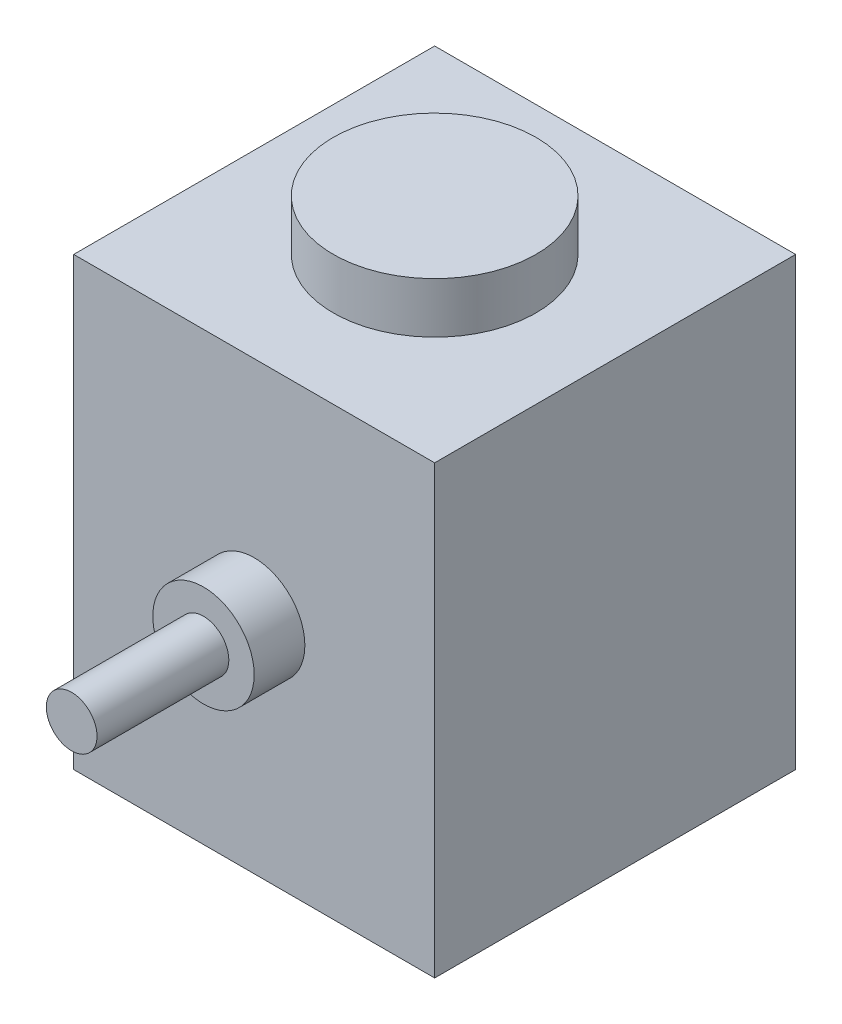
ISO-10303-21;
HEADER;
FILE_DESCRIPTION(('STEP AP214'),'2;1');
FILE_NAME('part.step','',(''),(''),'','','');
FILE_SCHEMA(('AUTOMOTIVE_DESIGN { 1 0 10303 214 1 1 1 1 }'));
ENDSEC;
DATA;
#1=APPLICATION_CONTEXT('core data for automotive mechanical design processes');
#2=APPLICATION_PROTOCOL_DEFINITION('international standard','automotive_design',2000,#1);
#3=PRODUCT_CONTEXT('',#1,'mechanical');
#4=PRODUCT('Part','Part','',(#3));
#5=PRODUCT_RELATED_PRODUCT_CATEGORY('part','',(#4));
#6=PRODUCT_DEFINITION_FORMATION('','',#4);
#7=PRODUCT_DEFINITION_CONTEXT('part definition',#1,'design');
#8=PRODUCT_DEFINITION('design','',#6,#7);
#9=PRODUCT_DEFINITION_SHAPE('','',#8);
#10=(LENGTH_UNIT() NAMED_UNIT(*) SI_UNIT(.MILLI.,.METRE.));
#11=(NAMED_UNIT(*) PLANE_ANGLE_UNIT() SI_UNIT($,.RADIAN.));
#12=(NAMED_UNIT(*) SI_UNIT($,.STERADIAN.) SOLID_ANGLE_UNIT());
#13=UNCERTAINTY_MEASURE_WITH_UNIT(LENGTH_MEASURE(1.E-05),#10,'distance_accuracy_value','');
#14=(GEOMETRIC_REPRESENTATION_CONTEXT(3) GLOBAL_UNCERTAINTY_ASSIGNED_CONTEXT((#13)) GLOBAL_UNIT_ASSIGNED_CONTEXT((#10,
#11,#12)) REPRESENTATION_CONTEXT('',''));
#15=CARTESIAN_POINT('',(0.,0.,0.));
#16=DIRECTION('',(0.,0.,1.));
#17=DIRECTION('',(1.,0.,0.));
#18=AXIS2_PLACEMENT_3D('',#15,#16,#17);
#19=CARTESIAN_POINT('',(-22.606,0.,0.));
#20=DIRECTION('',(1.,0.,0.));
#21=DIRECTION('',(0.,0.,-1.));
#22=AXIS2_PLACEMENT_3D('',#19,#20,#21);
#23=PLANE('',#22);
#24=DIRECTION('',(0.,-1.,0.));
#25=VECTOR('',#24,1.);
#26=CARTESIAN_POINT('',(-22.606,0.,45.212));
#27=LINE('',#26,#25);
#28=CARTESIAN_POINT('',(-22.606,62.23,45.212));
#29=VERTEX_POINT('',#28);
#30=CARTESIAN_POINT('',(-22.606,6.34999999999999,45.212));
#31=VERTEX_POINT('',#30);
#32=EDGE_CURVE('E111',#29,#31,#27,.T.);
#33=ORIENTED_EDGE('',*,*,#32,.F.);
#34=DIRECTION('',(0.,0.,-1.));
#35=VECTOR('',#34,1.);
#36=CARTESIAN_POINT('',(-22.606,62.23,0.));
#37=LINE('',#36,#35);
#38=CARTESIAN_POINT('',(-22.606,62.23,0.));
#39=VERTEX_POINT('',#38);
#40=EDGE_CURVE('E58',#29,#39,#37,.T.);
#41=ORIENTED_EDGE('',*,*,#40,.T.);
#42=DIRECTION('',(0.,1.,0.));
#43=VECTOR('',#42,1.);
#44=CARTESIAN_POINT('',(-22.606,0.,0.));
#45=LINE('',#44,#43);
#46=CARTESIAN_POINT('',(-22.606,6.35,0.));
#47=VERTEX_POINT('',#46);
#48=EDGE_CURVE('E102',#47,#39,#45,.T.);
#49=ORIENTED_EDGE('',*,*,#48,.F.);
#50=DIRECTION('',(0.,0.,1.));
#51=VECTOR('',#50,1.);
#52=CARTESIAN_POINT('',(-22.606,6.35,0.));
#53=LINE('',#52,#51);
#54=EDGE_CURVE('E66',#47,#31,#53,.T.);
#55=ORIENTED_EDGE('',*,*,#54,.T.);
#56=EDGE_LOOP('',(#33,#41,#49,#55));
#57=FACE_BOUND('',#56,.T.);
#58=ADVANCED_FACE('F41',(#57),#23,.F.);
#59=CARTESIAN_POINT('',(22.606,0.,0.));
#60=DIRECTION('',(1.,0.,0.));
#61=DIRECTION('',(0.,0.,-1.));
#62=AXIS2_PLACEMENT_3D('',#59,#60,#61);
#63=PLANE('',#62);
#64=DIRECTION('',(0.,0.,-1.));
#65=VECTOR('',#64,1.);
#66=CARTESIAN_POINT('',(22.606,62.23,0.));
#67=LINE('',#66,#65);
#68=CARTESIAN_POINT('',(22.606,62.23,45.212));
#69=VERTEX_POINT('',#68);
#70=CARTESIAN_POINT('',(22.606,62.23,0.));
#71=VERTEX_POINT('',#70);
#72=EDGE_CURVE('E86',#69,#71,#67,.T.);
#73=ORIENTED_EDGE('',*,*,#72,.F.);
#74=DIRECTION('',(0.,-1.,0.));
#75=VECTOR('',#74,1.);
#76=CARTESIAN_POINT('',(22.606,0.,45.212));
#77=LINE('',#76,#75);
#78=CARTESIAN_POINT('',(22.606,6.34999999999999,45.212));
#79=VERTEX_POINT('',#78);
#80=EDGE_CURVE('E90',#69,#79,#77,.T.);
#81=ORIENTED_EDGE('',*,*,#80,.T.);
#82=DIRECTION('',(0.,0.,1.));
#83=VECTOR('',#82,1.);
#84=CARTESIAN_POINT('',(22.606,6.35,0.));
#85=LINE('',#84,#83);
#86=CARTESIAN_POINT('',(22.606,6.35,0.));
#87=VERTEX_POINT('',#86);
#88=EDGE_CURVE('E104',#87,#79,#85,.T.);
#89=ORIENTED_EDGE('',*,*,#88,.F.);
#90=DIRECTION('',(0.,1.,0.));
#91=VECTOR('',#90,1.);
#92=CARTESIAN_POINT('',(22.606,0.,0.));
#93=LINE('',#92,#91);
#94=EDGE_CURVE('E93',#87,#71,#93,.T.);
#95=ORIENTED_EDGE('',*,*,#94,.T.);
#96=EDGE_LOOP('',(#73,#81,#89,#95));
#97=FACE_BOUND('',#96,.T.);
#98=ADVANCED_FACE('F88',(#97),#63,.T.);
#99=CARTESIAN_POINT('',(-22.606,0.,0.));
#100=DIRECTION('',(0.,0.,-1.));
#101=DIRECTION('',(-1.,0.,0.));
#102=AXIS2_PLACEMENT_3D('',#99,#100,#101);
#103=PLANE('',#102);
#104=DIRECTION('',(1.,0.,0.));
#105=VECTOR('',#104,1.);
#106=CARTESIAN_POINT('',(-22.606,62.23,0.));
#107=LINE('',#106,#105);
#108=EDGE_CURVE('E11',#39,#71,#107,.T.);
#109=ORIENTED_EDGE('',*,*,#108,.T.);
#110=ORIENTED_EDGE('',*,*,#94,.F.);
#111=DIRECTION('',(1.,0.,0.));
#112=VECTOR('',#111,1.);
#113=CARTESIAN_POINT('',(-22.606,6.35,0.));
#114=LINE('',#113,#112);
#115=EDGE_CURVE('E50',#47,#87,#114,.T.);
#116=ORIENTED_EDGE('',*,*,#115,.F.);
#117=ORIENTED_EDGE('',*,*,#48,.T.);
#118=EDGE_LOOP('',(#109,#110,#116,#117));
#119=FACE_BOUND('',#118,.T.);
#120=ADVANCED_FACE('F118',(#119),#103,.T.);
#121=CARTESIAN_POINT('',(-22.606,6.35,0.));
#122=DIRECTION('',(0.,1.,0.));
#123=DIRECTION('',(0.,0.,1.));
#124=AXIS2_PLACEMENT_3D('',#121,#122,#123);
#125=PLANE('',#124);
#126=CARTESIAN_POINT('',(0.,6.34999999999999,22.606));
#127=DIRECTION('',(0.,-1.,0.));
#128=DIRECTION('',(0.,0.,-1.));
#129=AXIS2_PLACEMENT_3D('',#126,#127,#128);
#130=CIRCLE('',#129,12.7);
#131=CARTESIAN_POINT('',(0.,6.34999999999999,9.90600000000001));
#132=VERTEX_POINT('',#131);
#133=EDGE_CURVE('E157',#132,#132,#130,.T.);
#134=ORIENTED_EDGE('',*,*,#133,.F.);
#135=EDGE_LOOP('',(#134));
#136=FACE_BOUND('',#135,.T.);
#137=ORIENTED_EDGE('',*,*,#115,.T.);
#138=ORIENTED_EDGE('',*,*,#88,.T.);
#139=DIRECTION('',(1.,0.,0.));
#140=VECTOR('',#139,1.);
#141=CARTESIAN_POINT('',(-22.606,6.34999999999999,45.212));
#142=LINE('',#141,#140);
#143=EDGE_CURVE('E101',#31,#79,#142,.T.);
#144=ORIENTED_EDGE('',*,*,#143,.F.);
#145=ORIENTED_EDGE('',*,*,#54,.F.);
#146=EDGE_LOOP('',(#137,#138,#144,#145));
#147=FACE_BOUND('',#146,.T.);
#148=ADVANCED_FACE('F116',(#136,#147),#125,.F.);
#149=CARTESIAN_POINT('',(-22.606,0.,45.212));
#150=DIRECTION('',(0.,0.,1.));
#151=DIRECTION('',(0.,-1.,0.));
#152=AXIS2_PLACEMENT_3D('',#149,#150,#151);
#153=PLANE('',#152);
#154=CARTESIAN_POINT('',(0.,34.29,45.212));
#155=DIRECTION('',(0.,0.,1.));
#156=DIRECTION('',(1.,0.,0.));
#157=AXIS2_PLACEMENT_3D('',#154,#155,#156);
#158=CIRCLE('',#157,6.35);
#159=CARTESIAN_POINT('',(6.35,34.29,45.212));
#160=VERTEX_POINT('',#159);
#161=EDGE_CURVE('E172',#160,#160,#158,.T.);
#162=ORIENTED_EDGE('',*,*,#161,.F.);
#163=EDGE_LOOP('',(#162));
#164=FACE_BOUND('',#163,.T.);
#165=ORIENTED_EDGE('',*,*,#143,.T.);
#166=ORIENTED_EDGE('',*,*,#80,.F.);
#167=DIRECTION('',(1.,0.,0.));
#168=VECTOR('',#167,1.);
#169=CARTESIAN_POINT('',(-22.606,62.23,45.212));
#170=LINE('',#169,#168);
#171=EDGE_CURVE('E45',#29,#69,#170,.T.);
#172=ORIENTED_EDGE('',*,*,#171,.F.);
#173=ORIENTED_EDGE('',*,*,#32,.T.);
#174=EDGE_LOOP('',(#165,#166,#172,#173));
#175=FACE_BOUND('',#174,.T.);
#176=ADVANCED_FACE('F103',(#164,#175),#153,.T.);
#177=CARTESIAN_POINT('',(-22.606,62.23,0.));
#178=DIRECTION('',(0.,1.,0.));
#179=DIRECTION('',(0.,0.,1.));
#180=AXIS2_PLACEMENT_3D('',#177,#178,#179);
#181=PLANE('',#180);
#182=CARTESIAN_POINT('',(0.,62.23,22.606));
#183=DIRECTION('',(0.,-1.,0.));
#184=DIRECTION('',(0.,0.,-1.));
#185=AXIS2_PLACEMENT_3D('',#182,#183,#184);
#186=CIRCLE('',#185,12.7);
#187=CARTESIAN_POINT('',(0.,62.23,9.906));
#188=VERTEX_POINT('',#187);
#189=EDGE_CURVE('E95',#188,#188,#186,.T.);
#190=ORIENTED_EDGE('',*,*,#189,.T.);
#191=EDGE_LOOP('',(#190));
#192=FACE_BOUND('',#191,.T.);
#193=ORIENTED_EDGE('',*,*,#171,.T.);
#194=ORIENTED_EDGE('',*,*,#72,.T.);
#195=ORIENTED_EDGE('',*,*,#108,.F.);
#196=ORIENTED_EDGE('',*,*,#40,.F.);
#197=EDGE_LOOP('',(#193,#194,#195,#196));
#198=FACE_BOUND('',#197,.T.);
#199=ADVANCED_FACE('F98',(#192,#198),#181,.T.);
#200=CARTESIAN_POINT('',(0.,6.35,22.606));
#201=DIRECTION('',(0.,-1.,0.));
#202=DIRECTION('',(0.,0.,-1.));
#203=AXIS2_PLACEMENT_3D('',#200,#201,#202);
#204=CYLINDRICAL_SURFACE('',#203,12.7);
#205=ORIENTED_EDGE('',*,*,#133,.T.);
#206=EDGE_LOOP('',(#205));
#207=FACE_BOUND('',#206,.T.);
#208=CARTESIAN_POINT('',(0.,0.,22.606));
#209=DIRECTION('',(0.,-1.,0.));
#210=DIRECTION('',(0.,0.,-1.));
#211=AXIS2_PLACEMENT_3D('',#208,#209,#210);
#212=CIRCLE('',#211,12.7);
#213=CARTESIAN_POINT('',(0.,0.,9.90600000000001));
#214=VERTEX_POINT('',#213);
#215=EDGE_CURVE('E153',#214,#214,#212,.T.);
#216=ORIENTED_EDGE('',*,*,#215,.F.);
#217=EDGE_LOOP('',(#216));
#218=FACE_BOUND('',#217,.T.);
#219=ADVANCED_FACE('F140',(#207,#218),#204,.T.);
#220=CARTESIAN_POINT('',(0.,6.35,22.606));
#221=DIRECTION('',(0.,-1.,0.));
#222=DIRECTION('',(0.,0.,-1.));
#223=AXIS2_PLACEMENT_3D('',#220,#221,#222);
#224=CYLINDRICAL_SURFACE('',#223,12.7);
#225=ORIENTED_EDGE('',*,*,#189,.F.);
#226=EDGE_LOOP('',(#225));
#227=FACE_BOUND('',#226,.T.);
#228=CARTESIAN_POINT('',(0.,68.58,22.606));
#229=DIRECTION('',(0.,-1.,0.));
#230=DIRECTION('',(0.,0.,-1.));
#231=AXIS2_PLACEMENT_3D('',#228,#229,#230);
#232=CIRCLE('',#231,12.7);
#233=CARTESIAN_POINT('',(0.,68.58,9.90599999999999));
#234=VERTEX_POINT('',#233);
#235=EDGE_CURVE('E150',#234,#234,#232,.T.);
#236=ORIENTED_EDGE('',*,*,#235,.T.);
#237=EDGE_LOOP('',(#236));
#238=FACE_BOUND('',#237,.T.);
#239=ADVANCED_FACE('F145',(#227,#238),#224,.T.);
#240=CARTESIAN_POINT('',(-22.606,68.58,0.));
#241=DIRECTION('',(0.,1.,0.));
#242=DIRECTION('',(0.,0.,1.));
#243=AXIS2_PLACEMENT_3D('',#240,#241,#242);
#244=PLANE('',#243);
#245=ORIENTED_EDGE('',*,*,#235,.F.);
#246=EDGE_LOOP('',(#245));
#247=FACE_BOUND('',#246,.T.);
#248=ADVANCED_FACE('F43',(#247),#244,.T.);
#249=CARTESIAN_POINT('',(-22.606,0.,0.));
#250=DIRECTION('',(0.,-1.,0.));
#251=DIRECTION('',(0.,0.,-1.));
#252=AXIS2_PLACEMENT_3D('',#249,#250,#251);
#253=PLANE('',#252);
#254=ORIENTED_EDGE('',*,*,#215,.T.);
#255=EDGE_LOOP('',(#254));
#256=FACE_BOUND('',#255,.T.);
#257=ADVANCED_FACE('F132',(#256),#253,.T.);
#258=CARTESIAN_POINT('',(0.,34.29,51.562));
#259=DIRECTION('',(0.,0.,-1.));
#260=DIRECTION('',(-1.,0.,0.));
#261=AXIS2_PLACEMENT_3D('',#258,#259,#260);
#262=CYLINDRICAL_SURFACE('',#261,6.35);
#263=CARTESIAN_POINT('',(0.,34.29,51.562));
#264=DIRECTION('',(0.,0.,1.));
#265=DIRECTION('',(1.,0.,0.));
#266=AXIS2_PLACEMENT_3D('',#263,#264,#265);
#267=CIRCLE('',#266,6.35);
#268=CARTESIAN_POINT('',(6.35,34.29,51.562));
#269=VERTEX_POINT('',#268);
#270=EDGE_CURVE('E165',#269,#269,#267,.T.);
#271=ORIENTED_EDGE('',*,*,#270,.F.);
#272=EDGE_LOOP('',(#271));
#273=FACE_BOUND('',#272,.T.);
#274=ORIENTED_EDGE('',*,*,#161,.T.);
#275=EDGE_LOOP('',(#274));
#276=FACE_BOUND('',#275,.T.);
#277=ADVANCED_FACE('F135',(#273,#276),#262,.T.);
#278=CARTESIAN_POINT('',(0.,0.,51.562));
#279=DIRECTION('',(0.,0.,1.));
#280=DIRECTION('',(1.,0.,0.));
#281=AXIS2_PLACEMENT_3D('',#278,#279,#280);
#282=PLANE('',#281);
#283=CARTESIAN_POINT('',(0.,34.29,51.562));
#284=DIRECTION('',(0.,0.,1.));
#285=DIRECTION('',(1.,0.,0.));
#286=AXIS2_PLACEMENT_3D('',#283,#284,#285);
#287=CIRCLE('',#286,3.175);
#288=CARTESIAN_POINT('',(3.175,34.29,51.562));
#289=VERTEX_POINT('',#288);
#290=EDGE_CURVE('E169',#289,#289,#287,.T.);
#291=ORIENTED_EDGE('',*,*,#290,.F.);
#292=EDGE_LOOP('',(#291));
#293=FACE_BOUND('',#292,.T.);
#294=ORIENTED_EDGE('',*,*,#270,.T.);
#295=EDGE_LOOP('',(#294));
#296=FACE_BOUND('',#295,.T.);
#297=ADVANCED_FACE('F181',(#293,#296),#282,.T.);
#298=CARTESIAN_POINT('',(0.,0.,68.072));
#299=DIRECTION('',(0.,0.,1.));
#300=DIRECTION('',(1.,0.,0.));
#301=AXIS2_PLACEMENT_3D('',#298,#299,#300);
#302=PLANE('',#301);
#303=CARTESIAN_POINT('',(0.,34.29,68.072));
#304=DIRECTION('',(0.,0.,1.));
#305=DIRECTION('',(1.,0.,0.));
#306=AXIS2_PLACEMENT_3D('',#303,#304,#305);
#307=CIRCLE('',#306,3.175);
#308=CARTESIAN_POINT('',(3.175,34.29,68.072));
#309=VERTEX_POINT('',#308);
#310=EDGE_CURVE('E159',#309,#309,#307,.T.);
#311=ORIENTED_EDGE('',*,*,#310,.T.);
#312=EDGE_LOOP('',(#311));
#313=FACE_BOUND('',#312,.T.);
#314=ADVANCED_FACE('F184',(#313),#302,.T.);
#315=CARTESIAN_POINT('',(0.,34.29,68.072));
#316=DIRECTION('',(0.,0.,-1.));
#317=DIRECTION('',(-1.,0.,0.));
#318=AXIS2_PLACEMENT_3D('',#315,#316,#317);
#319=CYLINDRICAL_SURFACE('',#318,3.175);
#320=ORIENTED_EDGE('',*,*,#290,.T.);
#321=EDGE_LOOP('',(#320));
#322=FACE_BOUND('',#321,.T.);
#323=ORIENTED_EDGE('',*,*,#310,.F.);
#324=EDGE_LOOP('',(#323));
#325=FACE_BOUND('',#324,.T.);
#326=ADVANCED_FACE('F178',(#322,#325),#319,.T.);
#327=CLOSED_SHELL('',(#58,#98,#120,#148,#176,#199,#219,#239,#248,#257,#277,#297,#314,#326));
#328=MANIFOLD_SOLID_BREP('B2',#327);
#329=ADVANCED_BREP_SHAPE_REPRESENTATION('',(#18,#328),#14);
#330=SHAPE_DEFINITION_REPRESENTATION(#9,#329);
ENDSEC;
END-ISO-10303-21;
